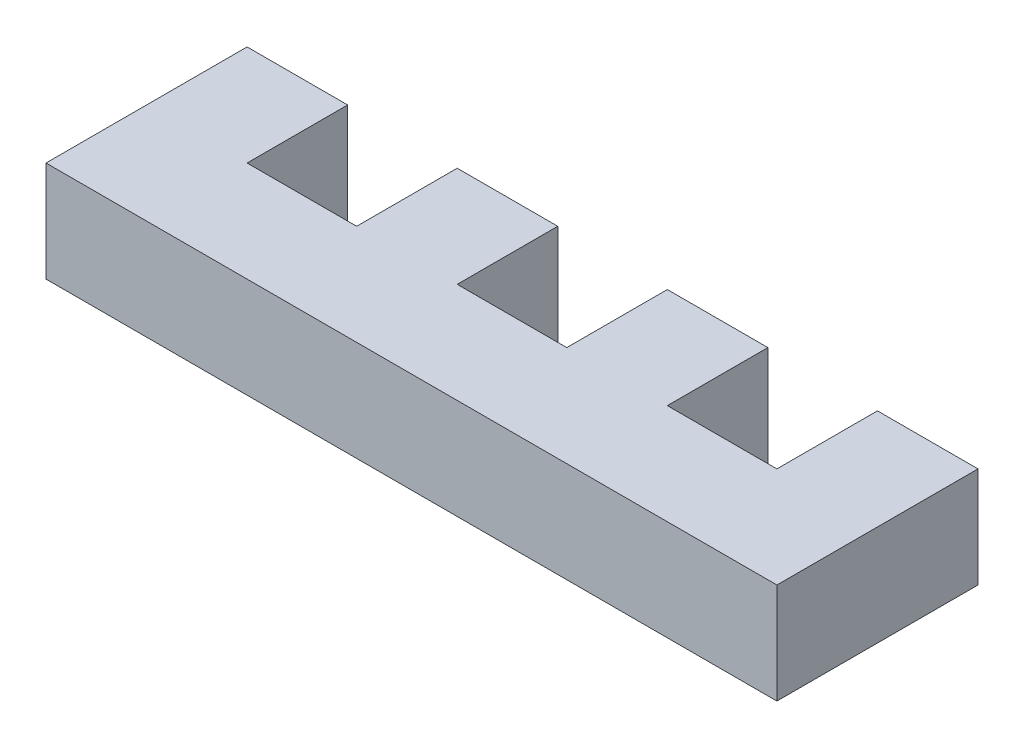
ISO-10303-21;
HEADER;
FILE_DESCRIPTION(('STEP AP214'),'2;1');
FILE_NAME('part.step','',(''),(''),'','','');
FILE_SCHEMA(('AUTOMOTIVE_DESIGN { 1 0 10303 214 1 1 1 1 }'));
ENDSEC;
DATA;
#1=APPLICATION_CONTEXT('core data for automotive mechanical design processes');
#2=APPLICATION_PROTOCOL_DEFINITION('international standard','automotive_design',2000,#1);
#3=PRODUCT_CONTEXT('',#1,'mechanical');
#4=PRODUCT('Part','Part','',(#3));
#5=PRODUCT_RELATED_PRODUCT_CATEGORY('part','',(#4));
#6=PRODUCT_DEFINITION_FORMATION('','',#4);
#7=PRODUCT_DEFINITION_CONTEXT('part definition',#1,'design');
#8=PRODUCT_DEFINITION('design','',#6,#7);
#9=PRODUCT_DEFINITION_SHAPE('','',#8);
#10=(LENGTH_UNIT() NAMED_UNIT(*) SI_UNIT(.MILLI.,.METRE.));
#11=(NAMED_UNIT(*) PLANE_ANGLE_UNIT() SI_UNIT($,.RADIAN.));
#12=(NAMED_UNIT(*) SI_UNIT($,.STERADIAN.) SOLID_ANGLE_UNIT());
#13=UNCERTAINTY_MEASURE_WITH_UNIT(LENGTH_MEASURE(1.E-05),#10,'distance_accuracy_value','');
#14=(GEOMETRIC_REPRESENTATION_CONTEXT(3) GLOBAL_UNCERTAINTY_ASSIGNED_CONTEXT((#13)) GLOBAL_UNIT_ASSIGNED_CONTEXT((#10,
#11,#12)) REPRESENTATION_CONTEXT('',''));
#15=CARTESIAN_POINT('',(0.,0.,0.));
#16=DIRECTION('',(0.,0.,1.));
#17=DIRECTION('',(1.,0.,0.));
#18=AXIS2_PLACEMENT_3D('',#15,#16,#17);
#19=CARTESIAN_POINT('',(0.,6.35,-6.35000000000019));
#20=DIRECTION('',(0.,0.,1.));
#21=DIRECTION('',(1.,0.,0.));
#22=AXIS2_PLACEMENT_3D('',#19,#20,#21);
#23=PLANE('',#22);
#24=DIRECTION('',(-1.,0.,0.));
#25=VECTOR('',#24,1.);
#26=CARTESIAN_POINT('',(0.,0.,-6.35000000000019));
#27=LINE('',#26,#25);
#28=CARTESIAN_POINT('',(20.192,0.,-6.35000000000019));
#29=VERTEX_POINT('',#28);
#30=CARTESIAN_POINT('',(13.272,0.,-6.35));
#31=VERTEX_POINT('',#30);
#32=EDGE_CURVE('E187',#29,#31,#27,.T.);
#33=ORIENTED_EDGE('',*,*,#32,.T.);
#34=DIRECTION('',(0.,-1.,0.));
#35=VECTOR('',#34,1.);
#36=CARTESIAN_POINT('',(13.272,6.35,-6.35));
#37=LINE('',#36,#35);
#38=CARTESIAN_POINT('',(13.272,6.35,-6.35));
#39=VERTEX_POINT('',#38);
#40=EDGE_CURVE('E11',#39,#31,#37,.T.);
#41=ORIENTED_EDGE('',*,*,#40,.F.);
#42=DIRECTION('',(-1.,0.,0.));
#43=VECTOR('',#42,1.);
#44=CARTESIAN_POINT('',(0.,6.35,-6.35000000000019));
#45=LINE('',#44,#43);
#46=CARTESIAN_POINT('',(20.192,6.35,-6.35000000000019));
#47=VERTEX_POINT('',#46);
#48=EDGE_CURVE('E118',#47,#39,#45,.T.);
#49=ORIENTED_EDGE('',*,*,#48,.F.);
#50=DIRECTION('',(0.,-1.,0.));
#51=VECTOR('',#50,1.);
#52=CARTESIAN_POINT('',(20.192,6.35,-6.35000000000019));
#53=LINE('',#52,#51);
#54=EDGE_CURVE('E183',#47,#29,#53,.T.);
#55=ORIENTED_EDGE('',*,*,#54,.T.);
#56=EDGE_LOOP('',(#33,#41,#49,#55));
#57=FACE_BOUND('',#56,.T.);
#58=ADVANCED_FACE('F41',(#57),#23,.F.);
#59=CARTESIAN_POINT('',(13.272,6.35,0.));
#60=DIRECTION('',(1.,0.,0.));
#61=DIRECTION('',(0.,0.,-1.));
#62=AXIS2_PLACEMENT_3D('',#59,#60,#61);
#63=PLANE('',#62);
#64=DIRECTION('',(0.,0.,1.));
#65=VECTOR('',#64,1.);
#66=CARTESIAN_POINT('',(13.272,0.,0.));
#67=LINE('',#66,#65);
#68=CARTESIAN_POINT('',(13.272,0.,-12.7));
#69=VERTEX_POINT('',#68);
#70=EDGE_CURVE('E191',#69,#31,#67,.T.);
#71=ORIENTED_EDGE('',*,*,#70,.F.);
#72=DIRECTION('',(0.,-1.,0.));
#73=VECTOR('',#72,1.);
#74=CARTESIAN_POINT('',(13.272,6.35,-12.7));
#75=LINE('',#74,#73);
#76=CARTESIAN_POINT('',(13.272,6.35,-12.7));
#77=VERTEX_POINT('',#76);
#78=EDGE_CURVE('E50',#77,#69,#75,.T.);
#79=ORIENTED_EDGE('',*,*,#78,.F.);
#80=DIRECTION('',(0.,0.,1.));
#81=VECTOR('',#80,1.);
#82=CARTESIAN_POINT('',(13.272,6.35,0.));
#83=LINE('',#82,#81);
#84=EDGE_CURVE('E535',#77,#39,#83,.T.);
#85=ORIENTED_EDGE('',*,*,#84,.T.);
#86=ORIENTED_EDGE('',*,*,#40,.T.);
#87=EDGE_LOOP('',(#71,#79,#85,#86));
#88=FACE_BOUND('',#87,.T.);
#89=ADVANCED_FACE('F291',(#88),#63,.T.);
#90=CARTESIAN_POINT('',(0.,6.35,-12.7));
#91=DIRECTION('',(0.,0.,-1.));
#92=DIRECTION('',(-1.,0.,0.));
#93=AXIS2_PLACEMENT_3D('',#90,#91,#92);
#94=PLANE('',#93);
#95=DIRECTION('',(1.,0.,0.));
#96=VECTOR('',#95,1.);
#97=CARTESIAN_POINT('',(0.,0.,-12.7));
#98=LINE('',#97,#96);
#99=CARTESIAN_POINT('',(6.922,0.,-12.7));
#100=VERTEX_POINT('',#99);
#101=EDGE_CURVE('E195',#100,#69,#98,.T.);
#102=ORIENTED_EDGE('',*,*,#101,.F.);
#103=DIRECTION('',(0.,-1.,0.));
#104=VECTOR('',#103,1.);
#105=CARTESIAN_POINT('',(6.922,6.35,-12.7));
#106=LINE('',#105,#104);
#107=CARTESIAN_POINT('',(6.922,6.35,-12.7));
#108=VERTEX_POINT('',#107);
#109=EDGE_CURVE('E279',#108,#100,#106,.T.);
#110=ORIENTED_EDGE('',*,*,#109,.F.);
#111=DIRECTION('',(1.,0.,0.));
#112=VECTOR('',#111,1.);
#113=CARTESIAN_POINT('',(0.,6.35,-12.7));
#114=LINE('',#113,#112);
#115=EDGE_CURVE('E288',#108,#77,#114,.T.);
#116=ORIENTED_EDGE('',*,*,#115,.T.);
#117=ORIENTED_EDGE('',*,*,#78,.T.);
#118=EDGE_LOOP('',(#102,#110,#116,#117));
#119=FACE_BOUND('',#118,.T.);
#120=ADVANCED_FACE('F286',(#119),#94,.T.);
#121=CARTESIAN_POINT('',(6.922,6.35,0.));
#122=DIRECTION('',(1.,0.,0.));
#123=DIRECTION('',(0.,0.,-1.));
#124=AXIS2_PLACEMENT_3D('',#121,#122,#123);
#125=PLANE('',#124);
#126=DIRECTION('',(0.,0.,1.));
#127=VECTOR('',#126,1.);
#128=CARTESIAN_POINT('',(6.922,0.,0.));
#129=LINE('',#128,#127);
#130=CARTESIAN_POINT('',(6.922,0.,0.));
#131=VERTEX_POINT('',#130);
#132=EDGE_CURVE('E199',#100,#131,#129,.T.);
#133=ORIENTED_EDGE('',*,*,#132,.T.);
#134=DIRECTION('',(0.,-1.,0.));
#135=VECTOR('',#134,1.);
#136=CARTESIAN_POINT('',(6.922,6.35,0.));
#137=LINE('',#136,#135);
#138=CARTESIAN_POINT('',(6.922,6.35,0.));
#139=VERTEX_POINT('',#138);
#140=EDGE_CURVE('E275',#139,#131,#137,.T.);
#141=ORIENTED_EDGE('',*,*,#140,.F.);
#142=DIRECTION('',(0.,0.,1.));
#143=VECTOR('',#142,1.);
#144=CARTESIAN_POINT('',(6.922,6.35,0.));
#145=LINE('',#144,#143);
#146=EDGE_CURVE('E310',#108,#139,#145,.T.);
#147=ORIENTED_EDGE('',*,*,#146,.F.);
#148=ORIENTED_EDGE('',*,*,#109,.T.);
#149=EDGE_LOOP('',(#133,#141,#147,#148));
#150=FACE_BOUND('',#149,.T.);
#151=ADVANCED_FACE('F299',(#150),#125,.F.);
#152=CARTESIAN_POINT('',(0.,6.35,0.));
#153=DIRECTION('',(0.,0.,-1.));
#154=DIRECTION('',(-1.,0.,0.));
#155=AXIS2_PLACEMENT_3D('',#152,#153,#154);
#156=PLANE('',#155);
#157=DIRECTION('',(1.,0.,0.));
#158=VECTOR('',#157,1.);
#159=CARTESIAN_POINT('',(0.,0.,0.));
#160=LINE('',#159,#158);
#161=CARTESIAN_POINT('',(53.082,0.,0.));
#162=VERTEX_POINT('',#161);
#163=EDGE_CURVE('E202',#131,#162,#160,.T.);
#164=ORIENTED_EDGE('',*,*,#163,.T.);
#165=DIRECTION('',(0.,-1.,0.));
#166=VECTOR('',#165,1.);
#167=CARTESIAN_POINT('',(53.082,6.35,0.));
#168=LINE('',#167,#166);
#169=CARTESIAN_POINT('',(53.082,6.35,0.));
#170=VERTEX_POINT('',#169);
#171=EDGE_CURVE('E272',#170,#162,#168,.T.);
#172=ORIENTED_EDGE('',*,*,#171,.F.);
#173=DIRECTION('',(1.,0.,0.));
#174=VECTOR('',#173,1.);
#175=CARTESIAN_POINT('',(0.,6.35,0.));
#176=LINE('',#175,#174);
#177=EDGE_CURVE('E305',#139,#170,#176,.T.);
#178=ORIENTED_EDGE('',*,*,#177,.F.);
#179=ORIENTED_EDGE('',*,*,#140,.T.);
#180=EDGE_LOOP('',(#164,#172,#178,#179));
#181=FACE_BOUND('',#180,.T.);
#182=ADVANCED_FACE('F303',(#181),#156,.F.);
#183=CARTESIAN_POINT('',(53.082,6.35,0.));
#184=DIRECTION('',(1.,0.,0.));
#185=DIRECTION('',(0.,0.,-1.));
#186=AXIS2_PLACEMENT_3D('',#183,#184,#185);
#187=PLANE('',#186);
#188=DIRECTION('',(0.,0.,1.));
#189=VECTOR('',#188,1.);
#190=CARTESIAN_POINT('',(53.082,0.,0.));
#191=LINE('',#190,#189);
#192=CARTESIAN_POINT('',(53.082,0.,-12.7000000000006));
#193=VERTEX_POINT('',#192);
#194=EDGE_CURVE('E206',#193,#162,#191,.T.);
#195=ORIENTED_EDGE('',*,*,#194,.F.);
#196=DIRECTION('',(0.,-1.,0.));
#197=VECTOR('',#196,1.);
#198=CARTESIAN_POINT('',(53.082,6.35,-12.7000000000006));
#199=LINE('',#198,#197);
#200=CARTESIAN_POINT('',(53.082,6.35,-12.7000000000006));
#201=VERTEX_POINT('',#200);
#202=EDGE_CURVE('E269',#201,#193,#199,.T.);
#203=ORIENTED_EDGE('',*,*,#202,.F.);
#204=DIRECTION('',(0.,0.,1.));
#205=VECTOR('',#204,1.);
#206=CARTESIAN_POINT('',(53.082,6.35,0.));
#207=LINE('',#206,#205);
#208=EDGE_CURVE('E309',#201,#170,#207,.T.);
#209=ORIENTED_EDGE('',*,*,#208,.T.);
#210=ORIENTED_EDGE('',*,*,#171,.T.);
#211=EDGE_LOOP('',(#195,#203,#209,#210));
#212=FACE_BOUND('',#211,.T.);
#213=ADVANCED_FACE('F373',(#212),#187,.T.);
#214=CARTESIAN_POINT('',(0.,6.35,-12.7000000000006));
#215=DIRECTION('',(0.,0.,-1.));
#216=DIRECTION('',(-1.,0.,0.));
#217=AXIS2_PLACEMENT_3D('',#214,#215,#216);
#218=PLANE('',#217);
#219=DIRECTION('',(1.,0.,0.));
#220=VECTOR('',#219,1.);
#221=CARTESIAN_POINT('',(0.,0.,-12.7000000000006));
#222=LINE('',#221,#220);
#223=CARTESIAN_POINT('',(46.732,0.,-12.7000000000006));
#224=VERTEX_POINT('',#223);
#225=EDGE_CURVE('E210',#224,#193,#222,.T.);
#226=ORIENTED_EDGE('',*,*,#225,.F.);
#227=DIRECTION('',(0.,-1.,0.));
#228=VECTOR('',#227,1.);
#229=CARTESIAN_POINT('',(46.732,6.35,-12.7000000000006));
#230=LINE('',#229,#228);
#231=CARTESIAN_POINT('',(46.732,6.35,-12.7000000000006));
#232=VERTEX_POINT('',#231);
#233=EDGE_CURVE('E266',#232,#224,#230,.T.);
#234=ORIENTED_EDGE('',*,*,#233,.F.);
#235=DIRECTION('',(1.,0.,0.));
#236=VECTOR('',#235,1.);
#237=CARTESIAN_POINT('',(0.,6.35,-12.7000000000006));
#238=LINE('',#237,#236);
#239=EDGE_CURVE('E314',#232,#201,#238,.T.);
#240=ORIENTED_EDGE('',*,*,#239,.T.);
#241=ORIENTED_EDGE('',*,*,#202,.T.);
#242=EDGE_LOOP('',(#226,#234,#240,#241));
#243=FACE_BOUND('',#242,.T.);
#244=ADVANCED_FACE('F376',(#243),#218,.T.);
#245=CARTESIAN_POINT('',(46.732,6.35,0.));
#246=DIRECTION('',(1.,0.,0.));
#247=DIRECTION('',(0.,0.,-1.));
#248=AXIS2_PLACEMENT_3D('',#245,#246,#247);
#249=PLANE('',#248);
#250=DIRECTION('',(0.,0.,1.));
#251=VECTOR('',#250,1.);
#252=CARTESIAN_POINT('',(46.732,0.,0.));
#253=LINE('',#252,#251);
#254=CARTESIAN_POINT('',(46.732,0.,-6.35000000000056));
#255=VERTEX_POINT('',#254);
#256=EDGE_CURVE('E214',#224,#255,#253,.T.);
#257=ORIENTED_EDGE('',*,*,#256,.T.);
#258=DIRECTION('',(0.,-1.,0.));
#259=VECTOR('',#258,1.);
#260=CARTESIAN_POINT('',(46.732,6.35,-6.35000000000056));
#261=LINE('',#260,#259);
#262=CARTESIAN_POINT('',(46.732,6.35,-6.35000000000056));
#263=VERTEX_POINT('',#262);
#264=EDGE_CURVE('E262',#263,#255,#261,.T.);
#265=ORIENTED_EDGE('',*,*,#264,.F.);
#266=DIRECTION('',(0.,0.,1.));
#267=VECTOR('',#266,1.);
#268=CARTESIAN_POINT('',(46.732,6.35,0.));
#269=LINE('',#268,#267);
#270=EDGE_CURVE('E322',#232,#263,#269,.T.);
#271=ORIENTED_EDGE('',*,*,#270,.F.);
#272=ORIENTED_EDGE('',*,*,#233,.T.);
#273=EDGE_LOOP('',(#257,#265,#271,#272));
#274=FACE_BOUND('',#273,.T.);
#275=ADVANCED_FACE('F380',(#274),#249,.F.);
#276=CARTESIAN_POINT('',(0.,6.35,-6.35000000000056));
#277=DIRECTION('',(0.,0.,1.));
#278=DIRECTION('',(1.,0.,0.));
#279=AXIS2_PLACEMENT_3D('',#276,#277,#278);
#280=PLANE('',#279);
#281=DIRECTION('',(-1.,0.,0.));
#282=VECTOR('',#281,1.);
#283=CARTESIAN_POINT('',(0.,0.,-6.35000000000056));
#284=LINE('',#283,#282);
#285=CARTESIAN_POINT('',(39.812,0.,-6.35000000000037));
#286=VERTEX_POINT('',#285);
#287=EDGE_CURVE('E217',#255,#286,#284,.T.);
#288=ORIENTED_EDGE('',*,*,#287,.T.);
#289=DIRECTION('',(0.,-1.,0.));
#290=VECTOR('',#289,1.);
#291=CARTESIAN_POINT('',(39.812,6.35,-6.35000000000037));
#292=LINE('',#291,#290);
#293=CARTESIAN_POINT('',(39.812,6.35,-6.35000000000037));
#294=VERTEX_POINT('',#293);
#295=EDGE_CURVE('E259',#294,#286,#292,.T.);
#296=ORIENTED_EDGE('',*,*,#295,.F.);
#297=DIRECTION('',(-1.,0.,0.));
#298=VECTOR('',#297,1.);
#299=CARTESIAN_POINT('',(0.,6.35,-6.35000000000056));
#300=LINE('',#299,#298);
#301=EDGE_CURVE('E325',#263,#294,#300,.T.);
#302=ORIENTED_EDGE('',*,*,#301,.F.);
#303=ORIENTED_EDGE('',*,*,#264,.T.);
#304=EDGE_LOOP('',(#288,#296,#302,#303));
#305=FACE_BOUND('',#304,.T.);
#306=ADVANCED_FACE('F384',(#305),#280,.F.);
#307=CARTESIAN_POINT('',(39.812,6.35,0.));
#308=DIRECTION('',(1.,0.,0.));
#309=DIRECTION('',(0.,0.,-1.));
#310=AXIS2_PLACEMENT_3D('',#307,#308,#309);
#311=PLANE('',#310);
#312=DIRECTION('',(0.,0.,1.));
#313=VECTOR('',#312,1.);
#314=CARTESIAN_POINT('',(39.812,0.,0.));
#315=LINE('',#314,#313);
#316=CARTESIAN_POINT('',(39.812,0.,-12.7000000000004));
#317=VERTEX_POINT('',#316);
#318=EDGE_CURVE('E221',#317,#286,#315,.T.);
#319=ORIENTED_EDGE('',*,*,#318,.F.);
#320=DIRECTION('',(0.,-1.,0.));
#321=VECTOR('',#320,1.);
#322=CARTESIAN_POINT('',(39.812,6.35,-12.7000000000004));
#323=LINE('',#322,#321);
#324=CARTESIAN_POINT('',(39.812,6.35,-12.7000000000004));
#325=VERTEX_POINT('',#324);
#326=EDGE_CURVE('E256',#325,#317,#323,.T.);
#327=ORIENTED_EDGE('',*,*,#326,.F.);
#328=DIRECTION('',(0.,0.,1.));
#329=VECTOR('',#328,1.);
#330=CARTESIAN_POINT('',(39.812,6.35,0.));
#331=LINE('',#330,#329);
#332=EDGE_CURVE('E328',#325,#294,#331,.T.);
#333=ORIENTED_EDGE('',*,*,#332,.T.);
#334=ORIENTED_EDGE('',*,*,#295,.T.);
#335=EDGE_LOOP('',(#319,#327,#333,#334));
#336=FACE_BOUND('',#335,.T.);
#337=ADVANCED_FACE('F388',(#336),#311,.T.);
#338=CARTESIAN_POINT('',(0.,6.35,-12.7000000000004));
#339=DIRECTION('',(0.,0.,-1.));
#340=DIRECTION('',(-1.,0.,0.));
#341=AXIS2_PLACEMENT_3D('',#338,#339,#340);
#342=PLANE('',#341);
#343=DIRECTION('',(1.,0.,0.));
#344=VECTOR('',#343,1.);
#345=CARTESIAN_POINT('',(0.,0.,-12.7000000000004));
#346=LINE('',#345,#344);
#347=CARTESIAN_POINT('',(33.462,0.,-12.7000000000004));
#348=VERTEX_POINT('',#347);
#349=EDGE_CURVE('E225',#348,#317,#346,.T.);
#350=ORIENTED_EDGE('',*,*,#349,.F.);
#351=DIRECTION('',(0.,-1.,0.));
#352=VECTOR('',#351,1.);
#353=CARTESIAN_POINT('',(33.462,6.35,-12.7000000000004));
#354=LINE('',#353,#352);
#355=CARTESIAN_POINT('',(33.462,6.35,-12.7000000000004));
#356=VERTEX_POINT('',#355);
#357=EDGE_CURVE('E253',#356,#348,#354,.T.);
#358=ORIENTED_EDGE('',*,*,#357,.F.);
#359=DIRECTION('',(1.,0.,0.));
#360=VECTOR('',#359,1.);
#361=CARTESIAN_POINT('',(0.,6.35,-12.7000000000004));
#362=LINE('',#361,#360);
#363=EDGE_CURVE('E332',#356,#325,#362,.T.);
#364=ORIENTED_EDGE('',*,*,#363,.T.);
#365=ORIENTED_EDGE('',*,*,#326,.T.);
#366=EDGE_LOOP('',(#350,#358,#364,#365));
#367=FACE_BOUND('',#366,.T.);
#368=ADVANCED_FACE('F392',(#367),#342,.T.);
#369=CARTESIAN_POINT('',(33.462,6.35,0.));
#370=DIRECTION('',(1.,0.,0.));
#371=DIRECTION('',(0.,0.,-1.));
#372=AXIS2_PLACEMENT_3D('',#369,#370,#371);
#373=PLANE('',#372);
#374=DIRECTION('',(0.,0.,1.));
#375=VECTOR('',#374,1.);
#376=CARTESIAN_POINT('',(33.462,0.,0.));
#377=LINE('',#376,#375);
#378=CARTESIAN_POINT('',(33.462,0.,-6.35000000000037));
#379=VERTEX_POINT('',#378);
#380=EDGE_CURVE('E229',#348,#379,#377,.T.);
#381=ORIENTED_EDGE('',*,*,#380,.T.);
#382=DIRECTION('',(0.,-1.,0.));
#383=VECTOR('',#382,1.);
#384=CARTESIAN_POINT('',(33.462,6.35,-6.35000000000037));
#385=LINE('',#384,#383);
#386=CARTESIAN_POINT('',(33.462,6.35,-6.35000000000037));
#387=VERTEX_POINT('',#386);
#388=EDGE_CURVE('E249',#387,#379,#385,.T.);
#389=ORIENTED_EDGE('',*,*,#388,.F.);
#390=DIRECTION('',(0.,0.,1.));
#391=VECTOR('',#390,1.);
#392=CARTESIAN_POINT('',(33.462,6.35,0.));
#393=LINE('',#392,#391);
#394=EDGE_CURVE('E336',#356,#387,#393,.T.);
#395=ORIENTED_EDGE('',*,*,#394,.F.);
#396=ORIENTED_EDGE('',*,*,#357,.T.);
#397=EDGE_LOOP('',(#381,#389,#395,#396));
#398=FACE_BOUND('',#397,.T.);
#399=ADVANCED_FACE('F344',(#398),#373,.F.);
#400=CARTESIAN_POINT('',(0.,6.35,-6.35000000000037));
#401=DIRECTION('',(0.,0.,1.));
#402=DIRECTION('',(1.,0.,0.));
#403=AXIS2_PLACEMENT_3D('',#400,#401,#402);
#404=PLANE('',#403);
#405=DIRECTION('',(-1.,0.,0.));
#406=VECTOR('',#405,1.);
#407=CARTESIAN_POINT('',(0.,0.,-6.35000000000037));
#408=LINE('',#407,#406);
#409=CARTESIAN_POINT('',(26.542,0.,-6.35000000000019));
#410=VERTEX_POINT('',#409);
#411=EDGE_CURVE('E232',#379,#410,#408,.T.);
#412=ORIENTED_EDGE('',*,*,#411,.T.);
#413=DIRECTION('',(0.,-1.,0.));
#414=VECTOR('',#413,1.);
#415=CARTESIAN_POINT('',(26.542,6.35,-6.35000000000019));
#416=LINE('',#415,#414);
#417=CARTESIAN_POINT('',(26.542,6.35,-6.35000000000019));
#418=VERTEX_POINT('',#417);
#419=EDGE_CURVE('E170',#418,#410,#416,.T.);
#420=ORIENTED_EDGE('',*,*,#419,.F.);
#421=DIRECTION('',(-1.,0.,0.));
#422=VECTOR('',#421,1.);
#423=CARTESIAN_POINT('',(0.,6.35,-6.35000000000037));
#424=LINE('',#423,#422);
#425=EDGE_CURVE('E175',#387,#418,#424,.T.);
#426=ORIENTED_EDGE('',*,*,#425,.F.);
#427=ORIENTED_EDGE('',*,*,#388,.T.);
#428=EDGE_LOOP('',(#412,#420,#426,#427));
#429=FACE_BOUND('',#428,.T.);
#430=ADVANCED_FACE('F348',(#429),#404,.F.);
#431=CARTESIAN_POINT('',(26.542,6.35,0.));
#432=DIRECTION('',(1.,0.,0.));
#433=DIRECTION('',(0.,0.,-1.));
#434=AXIS2_PLACEMENT_3D('',#431,#432,#433);
#435=PLANE('',#434);
#436=DIRECTION('',(0.,0.,1.));
#437=VECTOR('',#436,1.);
#438=CARTESIAN_POINT('',(26.542,0.,0.));
#439=LINE('',#438,#437);
#440=CARTESIAN_POINT('',(26.542,0.,-12.7000000000002));
#441=VERTEX_POINT('',#440);
#442=EDGE_CURVE('E164',#441,#410,#439,.T.);
#443=ORIENTED_EDGE('',*,*,#442,.F.);
#444=DIRECTION('',(0.,-1.,0.));
#445=VECTOR('',#444,1.);
#446=CARTESIAN_POINT('',(26.542,6.35,-12.7000000000002));
#447=LINE('',#446,#445);
#448=CARTESIAN_POINT('',(26.542,6.35,-12.7000000000002));
#449=VERTEX_POINT('',#448);
#450=EDGE_CURVE('E159',#449,#441,#447,.T.);
#451=ORIENTED_EDGE('',*,*,#450,.F.);
#452=DIRECTION('',(0.,0.,1.));
#453=VECTOR('',#452,1.);
#454=CARTESIAN_POINT('',(26.542,6.35,0.));
#455=LINE('',#454,#453);
#456=EDGE_CURVE('E162',#449,#418,#455,.T.);
#457=ORIENTED_EDGE('',*,*,#456,.T.);
#458=ORIENTED_EDGE('',*,*,#419,.T.);
#459=EDGE_LOOP('',(#443,#451,#457,#458));
#460=FACE_BOUND('',#459,.T.);
#461=ADVANCED_FACE('F161',(#460),#435,.T.);
#462=CARTESIAN_POINT('',(0.,6.35,-12.7000000000002));
#463=DIRECTION('',(0.,0.,-1.));
#464=DIRECTION('',(-1.,0.,0.));
#465=AXIS2_PLACEMENT_3D('',#462,#463,#464);
#466=PLANE('',#465);
#467=DIRECTION('',(1.,0.,0.));
#468=VECTOR('',#467,1.);
#469=CARTESIAN_POINT('',(0.,0.,-12.7000000000002));
#470=LINE('',#469,#468);
#471=CARTESIAN_POINT('',(20.192,0.,-12.7000000000002));
#472=VERTEX_POINT('',#471);
#473=EDGE_CURVE('E238',#472,#441,#470,.T.);
#474=ORIENTED_EDGE('',*,*,#473,.F.);
#475=DIRECTION('',(0.,-1.,0.));
#476=VECTOR('',#475,1.);
#477=CARTESIAN_POINT('',(20.192,6.35,-12.7000000000002));
#478=LINE('',#477,#476);
#479=CARTESIAN_POINT('',(20.192,6.35,-12.7000000000002));
#480=VERTEX_POINT('',#479);
#481=EDGE_CURVE('E109',#480,#472,#478,.T.);
#482=ORIENTED_EDGE('',*,*,#481,.F.);
#483=DIRECTION('',(1.,0.,0.));
#484=VECTOR('',#483,1.);
#485=CARTESIAN_POINT('',(0.,6.35,-12.7000000000002));
#486=LINE('',#485,#484);
#487=EDGE_CURVE('E173',#480,#449,#486,.T.);
#488=ORIENTED_EDGE('',*,*,#487,.T.);
#489=ORIENTED_EDGE('',*,*,#450,.T.);
#490=EDGE_LOOP('',(#474,#482,#488,#489));
#491=FACE_BOUND('',#490,.T.);
#492=ADVANCED_FACE('F179',(#491),#466,.T.);
#493=CARTESIAN_POINT('',(20.192,6.35,0.));
#494=DIRECTION('',(1.,0.,0.));
#495=DIRECTION('',(0.,0.,-1.));
#496=AXIS2_PLACEMENT_3D('',#493,#494,#495);
#497=PLANE('',#496);
#498=DIRECTION('',(0.,0.,1.));
#499=VECTOR('',#498,1.);
#500=CARTESIAN_POINT('',(20.192,0.,0.));
#501=LINE('',#500,#499);
#502=EDGE_CURVE('E112',#472,#29,#501,.T.);
#503=ORIENTED_EDGE('',*,*,#502,.T.);
#504=ORIENTED_EDGE('',*,*,#54,.F.);
#505=DIRECTION('',(0.,0.,1.));
#506=VECTOR('',#505,1.);
#507=CARTESIAN_POINT('',(20.192,6.35,0.));
#508=LINE('',#507,#506);
#509=EDGE_CURVE('E58',#480,#47,#508,.T.);
#510=ORIENTED_EDGE('',*,*,#509,.F.);
#511=ORIENTED_EDGE('',*,*,#481,.T.);
#512=EDGE_LOOP('',(#503,#504,#510,#511));
#513=FACE_BOUND('',#512,.T.);
#514=ADVANCED_FACE('F350',(#513),#497,.F.);
#515=CARTESIAN_POINT('',(0.,6.35,0.));
#516=DIRECTION('',(0.,1.,0.));
#517=DIRECTION('',(0.,0.,1.));
#518=AXIS2_PLACEMENT_3D('',#515,#516,#517);
#519=PLANE('',#518);
#520=ORIENTED_EDGE('',*,*,#48,.T.);
#521=ORIENTED_EDGE('',*,*,#84,.F.);
#522=ORIENTED_EDGE('',*,*,#115,.F.);
#523=ORIENTED_EDGE('',*,*,#146,.T.);
#524=ORIENTED_EDGE('',*,*,#177,.T.);
#525=ORIENTED_EDGE('',*,*,#208,.F.);
#526=ORIENTED_EDGE('',*,*,#239,.F.);
#527=ORIENTED_EDGE('',*,*,#270,.T.);
#528=ORIENTED_EDGE('',*,*,#301,.T.);
#529=ORIENTED_EDGE('',*,*,#332,.F.);
#530=ORIENTED_EDGE('',*,*,#363,.F.);
#531=ORIENTED_EDGE('',*,*,#394,.T.);
#532=ORIENTED_EDGE('',*,*,#425,.T.);
#533=ORIENTED_EDGE('',*,*,#456,.F.);
#534=ORIENTED_EDGE('',*,*,#487,.F.);
#535=ORIENTED_EDGE('',*,*,#509,.T.);
#536=EDGE_LOOP('',(#520,#521,#522,#523,#524,#525,#526,#527,#528,#529,#530,#531,#532,#533,#534,#535));
#537=FACE_BOUND('',#536,.T.);
#538=ADVANCED_FACE('F172',(#537),#519,.T.);
#539=CARTESIAN_POINT('',(0.,0.,0.));
#540=DIRECTION('',(0.,1.,0.));
#541=DIRECTION('',(0.,0.,1.));
#542=AXIS2_PLACEMENT_3D('',#539,#540,#541);
#543=PLANE('',#542);
#544=ORIENTED_EDGE('',*,*,#32,.F.);
#545=ORIENTED_EDGE('',*,*,#502,.F.);
#546=ORIENTED_EDGE('',*,*,#473,.T.);
#547=ORIENTED_EDGE('',*,*,#442,.T.);
#548=ORIENTED_EDGE('',*,*,#411,.F.);
#549=ORIENTED_EDGE('',*,*,#380,.F.);
#550=ORIENTED_EDGE('',*,*,#349,.T.);
#551=ORIENTED_EDGE('',*,*,#318,.T.);
#552=ORIENTED_EDGE('',*,*,#287,.F.);
#553=ORIENTED_EDGE('',*,*,#256,.F.);
#554=ORIENTED_EDGE('',*,*,#225,.T.);
#555=ORIENTED_EDGE('',*,*,#194,.T.);
#556=ORIENTED_EDGE('',*,*,#163,.F.);
#557=ORIENTED_EDGE('',*,*,#132,.F.);
#558=ORIENTED_EDGE('',*,*,#101,.T.);
#559=ORIENTED_EDGE('',*,*,#70,.T.);
#560=EDGE_LOOP('',(#544,#545,#546,#547,#548,#549,#550,#551,#552,#553,#554,#555,#556,#557,#558,#559));
#561=FACE_BOUND('',#560,.T.);
#562=ADVANCED_FACE('F295',(#561),#543,.F.);
#563=CLOSED_SHELL('',(#58,#89,#120,#151,#182,#213,#244,#275,#306,#337,#368,#399,#430,#461,#492,
#514,#538,#562));
#564=MANIFOLD_SOLID_BREP('B2',#563);
#565=ADVANCED_BREP_SHAPE_REPRESENTATION('',(#18,#564),#14);
#566=SHAPE_DEFINITION_REPRESENTATION(#9,#565);
ENDSEC;
END-ISO-10303-21;
